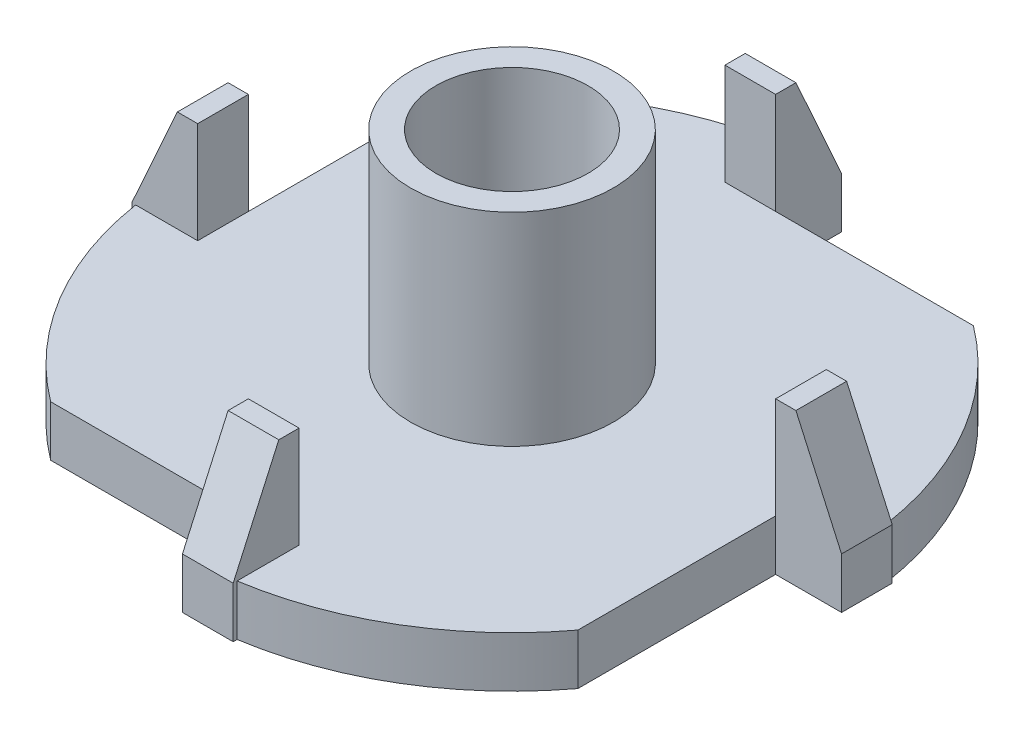
ISO-10303-21;
HEADER;
FILE_DESCRIPTION(('STEP AP214'),'2;1');
FILE_NAME('part.step','',(''),(''),'','','');
FILE_SCHEMA(('AUTOMOTIVE_DESIGN { 1 0 10303 214 1 1 1 1 }'));
ENDSEC;
DATA;
#1=APPLICATION_CONTEXT('core data for automotive mechanical design processes');
#2=APPLICATION_PROTOCOL_DEFINITION('international standard','automotive_design',2000,#1);
#3=PRODUCT_CONTEXT('',#1,'mechanical');
#4=PRODUCT('Part','Part','',(#3));
#5=PRODUCT_RELATED_PRODUCT_CATEGORY('part','',(#4));
#6=PRODUCT_DEFINITION_FORMATION('','',#4);
#7=PRODUCT_DEFINITION_CONTEXT('part definition',#1,'design');
#8=PRODUCT_DEFINITION('design','',#6,#7);
#9=PRODUCT_DEFINITION_SHAPE('','',#8);
#10=(LENGTH_UNIT() NAMED_UNIT(*) SI_UNIT(.MILLI.,.METRE.));
#11=(NAMED_UNIT(*) PLANE_ANGLE_UNIT() SI_UNIT($,.RADIAN.));
#12=(NAMED_UNIT(*) SI_UNIT($,.STERADIAN.) SOLID_ANGLE_UNIT());
#13=UNCERTAINTY_MEASURE_WITH_UNIT(LENGTH_MEASURE(1.E-05),#10,'distance_accuracy_value','');
#14=(GEOMETRIC_REPRESENTATION_CONTEXT(3) GLOBAL_UNCERTAINTY_ASSIGNED_CONTEXT((#13)) GLOBAL_UNIT_ASSIGNED_CONTEXT((#10,
#11,#12)) REPRESENTATION_CONTEXT('',''));
#15=CARTESIAN_POINT('',(0.,0.,0.));
#16=DIRECTION('',(0.,0.,1.));
#17=DIRECTION('',(1.,0.,0.));
#18=AXIS2_PLACEMENT_3D('',#15,#16,#17);
#19=CARTESIAN_POINT('',(0.,1.,0.));
#20=DIRECTION('',(0.,1.,0.));
#21=DIRECTION('',(0.,0.,1.));
#22=AXIS2_PLACEMENT_3D('',#19,#20,#21);
#23=PLANE('',#22);
#24=DIRECTION('',(0.,0.,-1.));
#25=VECTOR('',#24,1.);
#26=CARTESIAN_POINT('',(-5.2,1.,1.));
#27=LINE('',#26,#25);
#28=CARTESIAN_POINT('',(-5.2,1.,1.));
#29=VERTEX_POINT('',#28);
#30=CARTESIAN_POINT('',(-5.2,1.,0.));
#31=VERTEX_POINT('',#30);
#32=EDGE_CURVE('E56',#29,#31,#27,.T.);
#33=ORIENTED_EDGE('',*,*,#32,.F.);
#34=DIRECTION('',(-1.,0.,0.));
#35=VECTOR('',#34,1.);
#36=CARTESIAN_POINT('',(-5.2,1.,1.));
#37=LINE('',#36,#35);
#38=CARTESIAN_POINT('',(-6.42261628933257,1.,1.));
#39=VERTEX_POINT('',#38);
#40=EDGE_CURVE('E264',#29,#39,#37,.T.);
#41=ORIENTED_EDGE('',*,*,#40,.T.);
#42=CARTESIAN_POINT('',(0.,1.,0.));
#43=DIRECTION('',(0.,1.,0.));
#44=DIRECTION('',(0.,0.,1.));
#45=AXIS2_PLACEMENT_3D('',#42,#43,#44);
#46=CIRCLE('',#45,6.5);
#47=CARTESIAN_POINT('',(-3.9,1.,5.2));
#48=VERTEX_POINT('',#47);
#49=EDGE_CURVE('E364',#39,#48,#46,.T.);
#50=ORIENTED_EDGE('',*,*,#49,.T.);
#51=DIRECTION('',(1.,0.,0.));
#52=VECTOR('',#51,1.);
#53=CARTESIAN_POINT('',(-3.9,1.,5.2));
#54=LINE('',#53,#52);
#55=CARTESIAN_POINT('',(0.,1.,5.2));
#56=VERTEX_POINT('',#55);
#57=EDGE_CURVE('E367',#48,#56,#54,.T.);
#58=ORIENTED_EDGE('',*,*,#57,.T.);
#59=DIRECTION('',(-1.,0.,0.));
#60=VECTOR('',#59,1.);
#61=CARTESIAN_POINT('',(0.999999999999946,1.,5.20000000000001));
#62=LINE('',#61,#60);
#63=CARTESIAN_POINT('',(0.999999999999946,1.,5.20000000000001));
#64=VERTEX_POINT('',#63);
#65=EDGE_CURVE('E354',#64,#56,#62,.T.);
#66=ORIENTED_EDGE('',*,*,#65,.F.);
#67=DIRECTION('',(0.,0.,1.));
#68=VECTOR('',#67,1.);
#69=CARTESIAN_POINT('',(0.999999999999946,1.,5.20000000000001));
#70=LINE('',#69,#68);
#71=CARTESIAN_POINT('',(0.999999999999933,1.,6.42261628933258));
#72=VERTEX_POINT('',#71);
#73=EDGE_CURVE('E333',#64,#72,#70,.T.);
#74=ORIENTED_EDGE('',*,*,#73,.T.);
#75=CARTESIAN_POINT('',(0.,1.,0.));
#76=DIRECTION('',(0.,1.,0.));
#77=DIRECTION('',(0.,0.,1.));
#78=AXIS2_PLACEMENT_3D('',#75,#76,#77);
#79=CIRCLE('',#78,6.5);
#80=CARTESIAN_POINT('',(5.2,1.,3.9));
#81=VERTEX_POINT('',#80);
#82=EDGE_CURVE('E373',#72,#81,#79,.T.);
#83=ORIENTED_EDGE('',*,*,#82,.T.);
#84=DIRECTION('',(0.,0.,-1.));
#85=VECTOR('',#84,1.);
#86=CARTESIAN_POINT('',(5.2,1.,3.9));
#87=LINE('',#86,#85);
#88=CARTESIAN_POINT('',(5.2,1.,0.));
#89=VERTEX_POINT('',#88);
#90=EDGE_CURVE('E375',#81,#89,#87,.T.);
#91=ORIENTED_EDGE('',*,*,#90,.T.);
#92=DIRECTION('',(0.,0.,1.));
#93=VECTOR('',#92,1.);
#94=CARTESIAN_POINT('',(5.20000000000001,1.,-0.999999999999964));
#95=LINE('',#94,#93);
#96=CARTESIAN_POINT('',(5.20000000000001,1.,-0.999999999999964));
#97=VERTEX_POINT('',#96);
#98=EDGE_CURVE('E326',#97,#89,#95,.T.);
#99=ORIENTED_EDGE('',*,*,#98,.F.);
#100=DIRECTION('',(1.,0.,0.));
#101=VECTOR('',#100,1.);
#102=CARTESIAN_POINT('',(5.20000000000001,1.,-0.999999999999964));
#103=LINE('',#102,#101);
#104=CARTESIAN_POINT('',(6.42261628933257,1.,-0.999999999999955));
#105=VERTEX_POINT('',#104);
#106=EDGE_CURVE('E305',#97,#105,#103,.T.);
#107=ORIENTED_EDGE('',*,*,#106,.T.);
#108=CARTESIAN_POINT('',(0.,1.,0.));
#109=DIRECTION('',(0.,1.,0.));
#110=DIRECTION('',(0.,0.,1.));
#111=AXIS2_PLACEMENT_3D('',#108,#109,#110);
#112=CIRCLE('',#111,6.5);
#113=CARTESIAN_POINT('',(3.9,1.,-5.2));
#114=VERTEX_POINT('',#113);
#115=EDGE_CURVE('E380',#105,#114,#112,.T.);
#116=ORIENTED_EDGE('',*,*,#115,.T.);
#117=DIRECTION('',(-1.,0.,0.));
#118=VECTOR('',#117,1.);
#119=CARTESIAN_POINT('',(3.9,1.,-5.2));
#120=LINE('',#119,#118);
#121=CARTESIAN_POINT('',(0.,1.,-5.2));
#122=VERTEX_POINT('',#121);
#123=EDGE_CURVE('E382',#114,#122,#120,.T.);
#124=ORIENTED_EDGE('',*,*,#123,.T.);
#125=DIRECTION('',(1.,0.,0.));
#126=VECTOR('',#125,1.);
#127=CARTESIAN_POINT('',(-0.999999999999946,1.,-5.20000000000001));
#128=LINE('',#127,#126);
#129=CARTESIAN_POINT('',(-0.999999999999946,1.,-5.20000000000001));
#130=VERTEX_POINT('',#129);
#131=EDGE_CURVE('E63',#130,#122,#128,.T.);
#132=ORIENTED_EDGE('',*,*,#131,.F.);
#133=DIRECTION('',(0.,0.,-1.));
#134=VECTOR('',#133,1.);
#135=CARTESIAN_POINT('',(-0.999999999999946,1.,-5.20000000000001));
#136=LINE('',#135,#134);
#137=CARTESIAN_POINT('',(-0.999999999999933,1.,-6.42261628933258));
#138=VERTEX_POINT('',#137);
#139=EDGE_CURVE('E280',#130,#138,#136,.T.);
#140=ORIENTED_EDGE('',*,*,#139,.T.);
#141=CARTESIAN_POINT('',(0.,1.,0.));
#142=DIRECTION('',(0.,1.,0.));
#143=DIRECTION('',(0.,0.,1.));
#144=AXIS2_PLACEMENT_3D('',#141,#142,#143);
#145=CIRCLE('',#144,6.5);
#146=CARTESIAN_POINT('',(-5.2,1.,-3.9));
#147=VERTEX_POINT('',#146);
#148=EDGE_CURVE('E387',#138,#147,#145,.T.);
#149=ORIENTED_EDGE('',*,*,#148,.T.);
#150=DIRECTION('',(0.,0.,1.));
#151=VECTOR('',#150,1.);
#152=CARTESIAN_POINT('',(-5.2,1.,-3.9));
#153=LINE('',#152,#151);
#154=EDGE_CURVE('E389',#147,#31,#153,.T.);
#155=ORIENTED_EDGE('',*,*,#154,.T.);
#156=EDGE_LOOP('',(#33,#41,#50,#58,#66,#74,#83,#91,#99,#107,#116,#124,#132,#140,#149,#155));
#157=FACE_BOUND('',#156,.T.);
#158=CARTESIAN_POINT('',(0.,1.,0.));
#159=DIRECTION('',(0.,1.,0.));
#160=DIRECTION('',(0.,0.,1.));
#161=AXIS2_PLACEMENT_3D('',#158,#159,#160);
#162=CIRCLE('',#161,2.);
#163=CARTESIAN_POINT('',(0.,1.,2.));
#164=VERTEX_POINT('',#163);
#165=EDGE_CURVE('E935',#164,#164,#162,.T.);
#166=ORIENTED_EDGE('',*,*,#165,.F.);
#167=EDGE_LOOP('',(#166));
#168=FACE_BOUND('',#167,.T.);
#169=ADVANCED_FACE('F41',(#157,#168),#23,.T.);
#170=CARTESIAN_POINT('',(0.,0.,0.));
#171=DIRECTION('',(0.,1.,0.));
#172=DIRECTION('',(0.,0.,1.));
#173=AXIS2_PLACEMENT_3D('',#170,#171,#172);
#174=PLANE('',#173);
#175=CARTESIAN_POINT('',(0.,0.,0.));
#176=DIRECTION('',(0.,1.,0.));
#177=DIRECTION('',(0.,0.,1.));
#178=AXIS2_PLACEMENT_3D('',#175,#176,#177);
#179=CIRCLE('',#178,6.5);
#180=CARTESIAN_POINT('',(-6.42261628933257,0.,1.));
#181=VERTEX_POINT('',#180);
#182=CARTESIAN_POINT('',(-3.9,0.,5.2));
#183=VERTEX_POINT('',#182);
#184=EDGE_CURVE('E363',#181,#183,#179,.T.);
#185=ORIENTED_EDGE('',*,*,#184,.F.);
#186=DIRECTION('',(1.,0.,0.));
#187=VECTOR('',#186,1.);
#188=CARTESIAN_POINT('',(-6.5,0.,1.));
#189=LINE('',#188,#187);
#190=CARTESIAN_POINT('',(-6.5,0.,1.));
#191=VERTEX_POINT('',#190);
#192=EDGE_CURVE('E368',#191,#181,#189,.T.);
#193=ORIENTED_EDGE('',*,*,#192,.F.);
#194=DIRECTION('',(0.,0.,1.));
#195=VECTOR('',#194,1.);
#196=CARTESIAN_POINT('',(-6.5,0.,0.));
#197=LINE('',#196,#195);
#198=CARTESIAN_POINT('',(-6.5,0.,0.));
#199=VERTEX_POINT('',#198);
#200=EDGE_CURVE('E429',#199,#191,#197,.T.);
#201=ORIENTED_EDGE('',*,*,#200,.F.);
#202=DIRECTION('',(-1.,0.,0.));
#203=VECTOR('',#202,1.);
#204=CARTESIAN_POINT('',(-5.2,0.,0.));
#205=LINE('',#204,#203);
#206=CARTESIAN_POINT('',(-5.2,0.,0.));
#207=VERTEX_POINT('',#206);
#208=EDGE_CURVE('E427',#207,#199,#205,.T.);
#209=ORIENTED_EDGE('',*,*,#208,.F.);
#210=DIRECTION('',(0.,0.,1.));
#211=VECTOR('',#210,1.);
#212=CARTESIAN_POINT('',(-5.2,0.,-3.9));
#213=LINE('',#212,#211);
#214=CARTESIAN_POINT('',(-5.2,0.,-3.9));
#215=VERTEX_POINT('',#214);
#216=EDGE_CURVE('E425',#215,#207,#213,.T.);
#217=ORIENTED_EDGE('',*,*,#216,.F.);
#218=CARTESIAN_POINT('',(0.,0.,0.));
#219=DIRECTION('',(0.,1.,0.));
#220=DIRECTION('',(0.,0.,1.));
#221=AXIS2_PLACEMENT_3D('',#218,#219,#220);
#222=CIRCLE('',#221,6.5);
#223=CARTESIAN_POINT('',(-0.999999999999977,0.,-6.42261628933257));
#224=VERTEX_POINT('',#223);
#225=EDGE_CURVE('E423',#224,#215,#222,.T.);
#226=ORIENTED_EDGE('',*,*,#225,.F.);
#227=DIRECTION('',(0.,0.,1.));
#228=VECTOR('',#227,1.);
#229=CARTESIAN_POINT('',(-0.999999999999977,0.,-6.5));
#230=LINE('',#229,#228);
#231=CARTESIAN_POINT('',(-0.999999999999977,0.,-6.5));
#232=VERTEX_POINT('',#231);
#233=EDGE_CURVE('E421',#232,#224,#230,.T.);
#234=ORIENTED_EDGE('',*,*,#233,.F.);
#235=DIRECTION('',(-1.,0.,0.));
#236=VECTOR('',#235,1.);
#237=CARTESIAN_POINT('',(0.,0.,-6.5));
#238=LINE('',#237,#236);
#239=CARTESIAN_POINT('',(0.,0.,-6.5));
#240=VERTEX_POINT('',#239);
#241=EDGE_CURVE('E419',#240,#232,#238,.T.);
#242=ORIENTED_EDGE('',*,*,#241,.F.);
#243=DIRECTION('',(0.,0.,-1.));
#244=VECTOR('',#243,1.);
#245=CARTESIAN_POINT('',(0.,0.,-5.2));
#246=LINE('',#245,#244);
#247=CARTESIAN_POINT('',(0.,0.,-5.2));
#248=VERTEX_POINT('',#247);
#249=EDGE_CURVE('E417',#248,#240,#246,.T.);
#250=ORIENTED_EDGE('',*,*,#249,.F.);
#251=DIRECTION('',(-1.,0.,0.));
#252=VECTOR('',#251,1.);
#253=CARTESIAN_POINT('',(3.9,0.,-5.2));
#254=LINE('',#253,#252);
#255=CARTESIAN_POINT('',(3.9,0.,-5.2));
#256=VERTEX_POINT('',#255);
#257=EDGE_CURVE('E415',#256,#248,#254,.T.);
#258=ORIENTED_EDGE('',*,*,#257,.F.);
#259=CARTESIAN_POINT('',(0.,0.,0.));
#260=DIRECTION('',(0.,1.,0.));
#261=DIRECTION('',(0.,0.,1.));
#262=AXIS2_PLACEMENT_3D('',#259,#260,#261);
#263=CIRCLE('',#262,6.5);
#264=CARTESIAN_POINT('',(6.42261628933257,0.,-0.999999999999956));
#265=VERTEX_POINT('',#264);
#266=EDGE_CURVE('E413',#265,#256,#263,.T.);
#267=ORIENTED_EDGE('',*,*,#266,.F.);
#268=DIRECTION('',(-1.,0.,0.));
#269=VECTOR('',#268,1.);
#270=CARTESIAN_POINT('',(6.50000000000001,0.,-0.999999999999955));
#271=LINE('',#270,#269);
#272=CARTESIAN_POINT('',(6.50000000000001,0.,-0.999999999999955));
#273=VERTEX_POINT('',#272);
#274=EDGE_CURVE('E411',#273,#265,#271,.T.);
#275=ORIENTED_EDGE('',*,*,#274,.F.);
#276=DIRECTION('',(0.,0.,-1.));
#277=VECTOR('',#276,1.);
#278=CARTESIAN_POINT('',(6.5,0.,0.));
#279=LINE('',#278,#277);
#280=CARTESIAN_POINT('',(6.5,0.,0.));
#281=VERTEX_POINT('',#280);
#282=EDGE_CURVE('E409',#281,#273,#279,.T.);
#283=ORIENTED_EDGE('',*,*,#282,.F.);
#284=DIRECTION('',(1.,0.,0.));
#285=VECTOR('',#284,1.);
#286=CARTESIAN_POINT('',(5.2,0.,0.));
#287=LINE('',#286,#285);
#288=CARTESIAN_POINT('',(5.2,0.,0.));
#289=VERTEX_POINT('',#288);
#290=EDGE_CURVE('E407',#289,#281,#287,.T.);
#291=ORIENTED_EDGE('',*,*,#290,.F.);
#292=DIRECTION('',(0.,0.,-1.));
#293=VECTOR('',#292,1.);
#294=CARTESIAN_POINT('',(5.2,0.,3.9));
#295=LINE('',#294,#293);
#296=CARTESIAN_POINT('',(5.2,0.,3.9));
#297=VERTEX_POINT('',#296);
#298=EDGE_CURVE('E405',#297,#289,#295,.T.);
#299=ORIENTED_EDGE('',*,*,#298,.F.);
#300=CARTESIAN_POINT('',(0.,0.,0.));
#301=DIRECTION('',(0.,1.,0.));
#302=DIRECTION('',(0.,0.,1.));
#303=AXIS2_PLACEMENT_3D('',#300,#301,#302);
#304=CIRCLE('',#303,6.5);
#305=CARTESIAN_POINT('',(0.999999999999933,0.,6.42261628933258));
#306=VERTEX_POINT('',#305);
#307=EDGE_CURVE('E403',#306,#297,#304,.T.);
#308=ORIENTED_EDGE('',*,*,#307,.F.);
#309=DIRECTION('',(0.,0.,-1.));
#310=VECTOR('',#309,1.);
#311=CARTESIAN_POINT('',(0.999999999999932,0.,6.50000000000001));
#312=LINE('',#311,#310);
#313=CARTESIAN_POINT('',(0.999999999999932,0.,6.50000000000001));
#314=VERTEX_POINT('',#313);
#315=EDGE_CURVE('E401',#314,#306,#312,.T.);
#316=ORIENTED_EDGE('',*,*,#315,.F.);
#317=DIRECTION('',(1.,0.,0.));
#318=VECTOR('',#317,1.);
#319=CARTESIAN_POINT('',(0.,0.,6.5));
#320=LINE('',#319,#318);
#321=CARTESIAN_POINT('',(0.,0.,6.5));
#322=VERTEX_POINT('',#321);
#323=EDGE_CURVE('E399',#322,#314,#320,.T.);
#324=ORIENTED_EDGE('',*,*,#323,.F.);
#325=DIRECTION('',(0.,0.,1.));
#326=VECTOR('',#325,1.);
#327=CARTESIAN_POINT('',(0.,0.,5.2));
#328=LINE('',#327,#326);
#329=CARTESIAN_POINT('',(0.,0.,5.2));
#330=VERTEX_POINT('',#329);
#331=EDGE_CURVE('E397',#330,#322,#328,.T.);
#332=ORIENTED_EDGE('',*,*,#331,.F.);
#333=DIRECTION('',(1.,0.,0.));
#334=VECTOR('',#333,1.);
#335=CARTESIAN_POINT('',(-3.9,0.,5.2));
#336=LINE('',#335,#334);
#337=EDGE_CURVE('E395',#183,#330,#336,.T.);
#338=ORIENTED_EDGE('',*,*,#337,.F.);
#339=EDGE_LOOP('',(#185,#193,#201,#209,#217,#226,#234,#242,#250,#258,#267,#275,#283,#291,#299,
#308,#316,#324,#332,#338));
#340=FACE_BOUND('',#339,.T.);
#341=CARTESIAN_POINT('',(0.,0.,0.));
#342=DIRECTION('',(0.,1.,0.));
#343=DIRECTION('',(0.,0.,1.));
#344=AXIS2_PLACEMENT_3D('',#341,#342,#343);
#345=CIRCLE('',#344,1.5);
#346=CARTESIAN_POINT('',(0.,0.,1.5));
#347=VERTEX_POINT('',#346);
#348=EDGE_CURVE('E357',#347,#347,#345,.T.);
#349=ORIENTED_EDGE('',*,*,#348,.T.);
#350=EDGE_LOOP('',(#349));
#351=FACE_BOUND('',#350,.T.);
#352=ADVANCED_FACE('F493',(#340,#351),#174,.F.);
#353=CARTESIAN_POINT('',(0.,1.,0.));
#354=DIRECTION('',(0.,-1.,0.));
#355=DIRECTION('',(0.,0.,-1.));
#356=AXIS2_PLACEMENT_3D('',#353,#354,#355);
#357=CYLINDRICAL_SURFACE('',#356,6.5);
#358=ORIENTED_EDGE('',*,*,#184,.T.);
#359=DIRECTION('',(0.,-1.,0.));
#360=VECTOR('',#359,1.);
#361=CARTESIAN_POINT('',(-3.9,1.,5.2));
#362=LINE('',#361,#360);
#363=EDGE_CURVE('E11',#48,#183,#362,.T.);
#364=ORIENTED_EDGE('',*,*,#363,.F.);
#365=ORIENTED_EDGE('',*,*,#49,.F.);
#366=DIRECTION('',(0.,-1.,0.));
#367=VECTOR('',#366,1.);
#368=CARTESIAN_POINT('',(-6.42261628933257,1.,1.));
#369=LINE('',#368,#367);
#370=EDGE_CURVE('E392',#39,#181,#369,.T.);
#371=ORIENTED_EDGE('',*,*,#370,.T.);
#372=EDGE_LOOP('',(#358,#364,#365,#371));
#373=FACE_BOUND('',#372,.T.);
#374=ADVANCED_FACE('F43',(#373),#357,.T.);
#375=CARTESIAN_POINT('',(-3.9,1.,5.2));
#376=DIRECTION('',(0.,0.,-1.));
#377=DIRECTION('',(-1.,0.,0.));
#378=AXIS2_PLACEMENT_3D('',#375,#376,#377);
#379=PLANE('',#378);
#380=ORIENTED_EDGE('',*,*,#337,.T.);
#381=DIRECTION('',(0.,-1.,0.));
#382=VECTOR('',#381,1.);
#383=CARTESIAN_POINT('',(0.,1.,5.2));
#384=LINE('',#383,#382);
#385=EDGE_CURVE('E49',#56,#330,#384,.T.);
#386=ORIENTED_EDGE('',*,*,#385,.F.);
#387=ORIENTED_EDGE('',*,*,#57,.F.);
#388=ORIENTED_EDGE('',*,*,#363,.T.);
#389=EDGE_LOOP('',(#380,#386,#387,#388));
#390=FACE_BOUND('',#389,.T.);
#391=ADVANCED_FACE('F583',(#390),#379,.F.);
#392=CARTESIAN_POINT('',(0.,1.,5.2));
#393=DIRECTION('',(1.,0.,0.));
#394=DIRECTION('',(0.,0.,-1.));
#395=AXIS2_PLACEMENT_3D('',#392,#393,#394);
#396=PLANE('',#395);
#397=ORIENTED_EDGE('',*,*,#331,.T.);
#398=DIRECTION('',(0.,-1.,0.));
#399=VECTOR('',#398,1.);
#400=CARTESIAN_POINT('',(0.,1.,6.5));
#401=LINE('',#400,#399);
#402=CARTESIAN_POINT('',(0.,1.,6.5));
#403=VERTEX_POINT('',#402);
#404=EDGE_CURVE('E481',#403,#322,#401,.T.);
#405=ORIENTED_EDGE('',*,*,#404,.F.);
#406=DIRECTION('',(0.,0.911921505175106,-0.410364677328798));
#407=VECTOR('',#406,1.);
#408=CARTESIAN_POINT('',(0.,1.,6.5));
#409=LINE('',#408,#407);
#410=CARTESIAN_POINT('',(0.,3.,5.6));
#411=VERTEX_POINT('',#410);
#412=EDGE_CURVE('E329',#403,#411,#409,.T.);
#413=ORIENTED_EDGE('',*,*,#412,.T.);
#414=DIRECTION('',(0.,0.,-1.));
#415=VECTOR('',#414,1.);
#416=CARTESIAN_POINT('',(0.,3.,5.2));
#417=LINE('',#416,#415);
#418=CARTESIAN_POINT('',(0.,3.,5.2));
#419=VERTEX_POINT('',#418);
#420=EDGE_CURVE('E349',#411,#419,#417,.T.);
#421=ORIENTED_EDGE('',*,*,#420,.T.);
#422=DIRECTION('',(0.,-1.,0.));
#423=VECTOR('',#422,1.);
#424=CARTESIAN_POINT('',(0.,1.,5.2));
#425=LINE('',#424,#423);
#426=EDGE_CURVE('E337',#419,#56,#425,.T.);
#427=ORIENTED_EDGE('',*,*,#426,.T.);
#428=ORIENTED_EDGE('',*,*,#385,.T.);
#429=EDGE_LOOP('',(#397,#405,#413,#421,#427,#428));
#430=FACE_BOUND('',#429,.T.);
#431=ADVANCED_FACE('F487',(#430),#396,.F.);
#432=CARTESIAN_POINT('',(0.,1.,6.5));
#433=DIRECTION('',(0.,0.,-1.));
#434=DIRECTION('',(-1.,0.,0.));
#435=AXIS2_PLACEMENT_3D('',#432,#433,#434);
#436=PLANE('',#435);
#437=ORIENTED_EDGE('',*,*,#323,.T.);
#438=DIRECTION('',(0.,-1.,0.));
#439=VECTOR('',#438,1.);
#440=CARTESIAN_POINT('',(0.999999999999932,1.,6.50000000000001));
#441=LINE('',#440,#439);
#442=CARTESIAN_POINT('',(0.999999999999932,1.,6.50000000000001));
#443=VERTEX_POINT('',#442);
#444=EDGE_CURVE('E478',#443,#314,#441,.T.);
#445=ORIENTED_EDGE('',*,*,#444,.F.);
#446=DIRECTION('',(1.,0.,0.));
#447=VECTOR('',#446,1.);
#448=CARTESIAN_POINT('',(0.,1.,6.5));
#449=LINE('',#448,#447);
#450=EDGE_CURVE('E370',#403,#443,#449,.T.);
#451=ORIENTED_EDGE('',*,*,#450,.F.);
#452=ORIENTED_EDGE('',*,*,#404,.T.);
#453=EDGE_LOOP('',(#437,#445,#451,#452));
#454=FACE_BOUND('',#453,.T.);
#455=ADVANCED_FACE('F498',(#454),#436,.F.);
#456=CARTESIAN_POINT('',(0.999999999999932,1.,6.50000000000001));
#457=DIRECTION('',(-1.,0.,0.));
#458=DIRECTION('',(0.,0.,1.));
#459=AXIS2_PLACEMENT_3D('',#456,#457,#458);
#460=PLANE('',#459);
#461=ORIENTED_EDGE('',*,*,#315,.T.);
#462=DIRECTION('',(0.,-1.,0.));
#463=VECTOR('',#462,1.);
#464=CARTESIAN_POINT('',(0.999999999999933,1.,6.42261628933258));
#465=LINE('',#464,#463);
#466=EDGE_CURVE('E475',#72,#306,#465,.T.);
#467=ORIENTED_EDGE('',*,*,#466,.F.);
#468=ORIENTED_EDGE('',*,*,#73,.F.);
#469=DIRECTION('',(0.,-1.,0.));
#470=VECTOR('',#469,1.);
#471=CARTESIAN_POINT('',(0.999999999999946,1.,5.20000000000001));
#472=LINE('',#471,#470);
#473=CARTESIAN_POINT('',(0.999999999999946,3.,5.20000000000001));
#474=VERTEX_POINT('',#473);
#475=EDGE_CURVE('E343',#474,#64,#472,.T.);
#476=ORIENTED_EDGE('',*,*,#475,.F.);
#477=DIRECTION('',(0.,0.,-1.));
#478=VECTOR('',#477,1.);
#479=CARTESIAN_POINT('',(0.999999999999946,3.,5.20000000000001));
#480=LINE('',#479,#478);
#481=CARTESIAN_POINT('',(0.999999999999941,3.,5.60000000000001));
#482=VERTEX_POINT('',#481);
#483=EDGE_CURVE('E340',#482,#474,#480,.T.);
#484=ORIENTED_EDGE('',*,*,#483,.F.);
#485=DIRECTION('',(0.,0.911921505175106,-0.410364677328798));
#486=VECTOR('',#485,1.);
#487=CARTESIAN_POINT('',(0.999999999999932,1.,6.50000000000001));
#488=LINE('',#487,#486);
#489=EDGE_CURVE('E336',#443,#482,#488,.T.);
#490=ORIENTED_EDGE('',*,*,#489,.F.);
#491=ORIENTED_EDGE('',*,*,#444,.T.);
#492=EDGE_LOOP('',(#461,#467,#468,#476,#484,#490,#491));
#493=FACE_BOUND('',#492,.T.);
#494=ADVANCED_FACE('F502',(#493),#460,.F.);
#495=CARTESIAN_POINT('',(0.,1.,0.));
#496=DIRECTION('',(0.,-1.,0.));
#497=DIRECTION('',(0.,0.,-1.));
#498=AXIS2_PLACEMENT_3D('',#495,#496,#497);
#499=CYLINDRICAL_SURFACE('',#498,6.5);
#500=ORIENTED_EDGE('',*,*,#307,.T.);
#501=DIRECTION('',(0.,-1.,0.));
#502=VECTOR('',#501,1.);
#503=CARTESIAN_POINT('',(5.2,1.,3.9));
#504=LINE('',#503,#502);
#505=EDGE_CURVE('E472',#81,#297,#504,.T.);
#506=ORIENTED_EDGE('',*,*,#505,.F.);
#507=ORIENTED_EDGE('',*,*,#82,.F.);
#508=ORIENTED_EDGE('',*,*,#466,.T.);
#509=EDGE_LOOP('',(#500,#506,#507,#508));
#510=FACE_BOUND('',#509,.T.);
#511=ADVANCED_FACE('F516',(#510),#499,.T.);
#512=CARTESIAN_POINT('',(5.2,1.,3.9));
#513=DIRECTION('',(-1.,0.,0.));
#514=DIRECTION('',(0.,0.,1.));
#515=AXIS2_PLACEMENT_3D('',#512,#513,#514);
#516=PLANE('',#515);
#517=ORIENTED_EDGE('',*,*,#298,.T.);
#518=DIRECTION('',(0.,-1.,0.));
#519=VECTOR('',#518,1.);
#520=CARTESIAN_POINT('',(5.2,1.,0.));
#521=LINE('',#520,#519);
#522=EDGE_CURVE('E469',#89,#289,#521,.T.);
#523=ORIENTED_EDGE('',*,*,#522,.F.);
#524=ORIENTED_EDGE('',*,*,#90,.F.);
#525=ORIENTED_EDGE('',*,*,#505,.T.);
#526=EDGE_LOOP('',(#517,#523,#524,#525));
#527=FACE_BOUND('',#526,.T.);
#528=ADVANCED_FACE('F523',(#527),#516,.F.);
#529=CARTESIAN_POINT('',(5.2,1.,0.));
#530=DIRECTION('',(0.,0.,-1.));
#531=DIRECTION('',(-1.,0.,0.));
#532=AXIS2_PLACEMENT_3D('',#529,#530,#531);
#533=PLANE('',#532);
#534=ORIENTED_EDGE('',*,*,#290,.T.);
#535=DIRECTION('',(0.,-1.,0.));
#536=VECTOR('',#535,1.);
#537=CARTESIAN_POINT('',(6.5,1.,0.));
#538=LINE('',#537,#536);
#539=CARTESIAN_POINT('',(6.5,1.,0.));
#540=VERTEX_POINT('',#539);
#541=EDGE_CURVE('E466',#540,#281,#538,.T.);
#542=ORIENTED_EDGE('',*,*,#541,.F.);
#543=DIRECTION('',(-0.410364677328798,0.911921505175106,0.));
#544=VECTOR('',#543,1.);
#545=CARTESIAN_POINT('',(6.5,1.,0.));
#546=LINE('',#545,#544);
#547=CARTESIAN_POINT('',(5.6,3.,0.));
#548=VERTEX_POINT('',#547);
#549=EDGE_CURVE('E301',#540,#548,#546,.T.);
#550=ORIENTED_EDGE('',*,*,#549,.T.);
#551=DIRECTION('',(-1.,0.,0.));
#552=VECTOR('',#551,1.);
#553=CARTESIAN_POINT('',(5.2,3.,0.));
#554=LINE('',#553,#552);
#555=CARTESIAN_POINT('',(5.2,3.,0.));
#556=VERTEX_POINT('',#555);
#557=EDGE_CURVE('E321',#548,#556,#554,.T.);
#558=ORIENTED_EDGE('',*,*,#557,.T.);
#559=DIRECTION('',(0.,-1.,0.));
#560=VECTOR('',#559,1.);
#561=CARTESIAN_POINT('',(5.2,1.,0.));
#562=LINE('',#561,#560);
#563=EDGE_CURVE('E309',#556,#89,#562,.T.);
#564=ORIENTED_EDGE('',*,*,#563,.T.);
#565=ORIENTED_EDGE('',*,*,#522,.T.);
#566=EDGE_LOOP('',(#534,#542,#550,#558,#564,#565));
#567=FACE_BOUND('',#566,.T.);
#568=ADVANCED_FACE('F526',(#567),#533,.F.);
#569=CARTESIAN_POINT('',(6.5,1.,0.));
#570=DIRECTION('',(-1.,0.,0.));
#571=DIRECTION('',(0.,0.,1.));
#572=AXIS2_PLACEMENT_3D('',#569,#570,#571);
#573=PLANE('',#572);
#574=ORIENTED_EDGE('',*,*,#282,.T.);
#575=DIRECTION('',(0.,-1.,0.));
#576=VECTOR('',#575,1.);
#577=CARTESIAN_POINT('',(6.50000000000001,1.,-0.999999999999955));
#578=LINE('',#577,#576);
#579=CARTESIAN_POINT('',(6.50000000000001,1.,-0.999999999999955));
#580=VERTEX_POINT('',#579);
#581=EDGE_CURVE('E463',#580,#273,#578,.T.);
#582=ORIENTED_EDGE('',*,*,#581,.F.);
#583=DIRECTION('',(0.,0.,-1.));
#584=VECTOR('',#583,1.);
#585=CARTESIAN_POINT('',(6.5,1.,0.));
#586=LINE('',#585,#584);
#587=EDGE_CURVE('E377',#540,#580,#586,.T.);
#588=ORIENTED_EDGE('',*,*,#587,.F.);
#589=ORIENTED_EDGE('',*,*,#541,.T.);
#590=EDGE_LOOP('',(#574,#582,#588,#589));
#591=FACE_BOUND('',#590,.T.);
#592=ADVANCED_FACE('F624',(#591),#573,.F.);
#593=CARTESIAN_POINT('',(6.50000000000001,1.,-0.999999999999955));
#594=DIRECTION('',(0.,0.,1.));
#595=DIRECTION('',(1.,0.,0.));
#596=AXIS2_PLACEMENT_3D('',#593,#594,#595);
#597=PLANE('',#596);
#598=ORIENTED_EDGE('',*,*,#274,.T.);
#599=DIRECTION('',(0.,-1.,0.));
#600=VECTOR('',#599,1.);
#601=CARTESIAN_POINT('',(6.42261628933257,1.,-0.999999999999956));
#602=LINE('',#601,#600);
#603=EDGE_CURVE('E460',#105,#265,#602,.T.);
#604=ORIENTED_EDGE('',*,*,#603,.F.);
#605=ORIENTED_EDGE('',*,*,#106,.F.);
#606=DIRECTION('',(0.,-1.,0.));
#607=VECTOR('',#606,1.);
#608=CARTESIAN_POINT('',(5.20000000000001,1.,-0.999999999999964));
#609=LINE('',#608,#607);
#610=CARTESIAN_POINT('',(5.20000000000001,3.,-0.999999999999964));
#611=VERTEX_POINT('',#610);
#612=EDGE_CURVE('E315',#611,#97,#609,.T.);
#613=ORIENTED_EDGE('',*,*,#612,.F.);
#614=DIRECTION('',(-1.,0.,0.));
#615=VECTOR('',#614,1.);
#616=CARTESIAN_POINT('',(5.20000000000001,3.,-0.999999999999964));
#617=LINE('',#616,#615);
#618=CARTESIAN_POINT('',(5.60000000000001,3.,-0.999999999999961));
#619=VERTEX_POINT('',#618);
#620=EDGE_CURVE('E312',#619,#611,#617,.T.);
#621=ORIENTED_EDGE('',*,*,#620,.F.);
#622=DIRECTION('',(-0.410364677328798,0.911921505175106,0.));
#623=VECTOR('',#622,1.);
#624=CARTESIAN_POINT('',(6.50000000000001,1.,-0.999999999999955));
#625=LINE('',#624,#623);
#626=EDGE_CURVE('E308',#580,#619,#625,.T.);
#627=ORIENTED_EDGE('',*,*,#626,.F.);
#628=ORIENTED_EDGE('',*,*,#581,.T.);
#629=EDGE_LOOP('',(#598,#604,#605,#613,#621,#627,#628));
#630=FACE_BOUND('',#629,.T.);
#631=ADVANCED_FACE('F535',(#630),#597,.F.);
#632=CARTESIAN_POINT('',(0.,1.,0.));
#633=DIRECTION('',(0.,-1.,0.));
#634=DIRECTION('',(0.,0.,-1.));
#635=AXIS2_PLACEMENT_3D('',#632,#633,#634);
#636=CYLINDRICAL_SURFACE('',#635,6.5);
#637=ORIENTED_EDGE('',*,*,#266,.T.);
#638=DIRECTION('',(0.,-1.,0.));
#639=VECTOR('',#638,1.);
#640=CARTESIAN_POINT('',(3.9,1.,-5.2));
#641=LINE('',#640,#639);
#642=EDGE_CURVE('E457',#114,#256,#641,.T.);
#643=ORIENTED_EDGE('',*,*,#642,.F.);
#644=ORIENTED_EDGE('',*,*,#115,.F.);
#645=ORIENTED_EDGE('',*,*,#603,.T.);
#646=EDGE_LOOP('',(#637,#643,#644,#645));
#647=FACE_BOUND('',#646,.T.);
#648=ADVANCED_FACE('F540',(#647),#636,.T.);
#649=CARTESIAN_POINT('',(3.9,1.,-5.2));
#650=DIRECTION('',(0.,0.,1.));
#651=DIRECTION('',(1.,0.,0.));
#652=AXIS2_PLACEMENT_3D('',#649,#650,#651);
#653=PLANE('',#652);
#654=ORIENTED_EDGE('',*,*,#257,.T.);
#655=DIRECTION('',(0.,-1.,0.));
#656=VECTOR('',#655,1.);
#657=CARTESIAN_POINT('',(0.,1.,-5.2));
#658=LINE('',#657,#656);
#659=EDGE_CURVE('E454',#122,#248,#658,.T.);
#660=ORIENTED_EDGE('',*,*,#659,.F.);
#661=ORIENTED_EDGE('',*,*,#123,.F.);
#662=ORIENTED_EDGE('',*,*,#642,.T.);
#663=EDGE_LOOP('',(#654,#660,#661,#662));
#664=FACE_BOUND('',#663,.T.);
#665=ADVANCED_FACE('F547',(#664),#653,.F.);
#666=CARTESIAN_POINT('',(0.,1.,-5.2));
#667=DIRECTION('',(-1.,0.,0.));
#668=DIRECTION('',(0.,0.,1.));
#669=AXIS2_PLACEMENT_3D('',#666,#667,#668);
#670=PLANE('',#669);
#671=ORIENTED_EDGE('',*,*,#249,.T.);
#672=DIRECTION('',(0.,-1.,0.));
#673=VECTOR('',#672,1.);
#674=CARTESIAN_POINT('',(0.,1.,-6.5));
#675=LINE('',#674,#673);
#676=CARTESIAN_POINT('',(0.,1.,-6.5));
#677=VERTEX_POINT('',#676);
#678=EDGE_CURVE('E451',#677,#240,#675,.T.);
#679=ORIENTED_EDGE('',*,*,#678,.F.);
#680=DIRECTION('',(0.,0.911921505175106,0.410364677328798));
#681=VECTOR('',#680,1.);
#682=CARTESIAN_POINT('',(0.,1.,-6.5));
#683=LINE('',#682,#681);
#684=CARTESIAN_POINT('',(0.,3.,-5.6));
#685=VERTEX_POINT('',#684);
#686=EDGE_CURVE('E278',#677,#685,#683,.T.);
#687=ORIENTED_EDGE('',*,*,#686,.T.);
#688=DIRECTION('',(0.,0.,1.));
#689=VECTOR('',#688,1.);
#690=CARTESIAN_POINT('',(0.,3.,-5.2));
#691=LINE('',#690,#689);
#692=CARTESIAN_POINT('',(0.,3.,-5.2));
#693=VERTEX_POINT('',#692);
#694=EDGE_CURVE('E295',#685,#693,#691,.T.);
#695=ORIENTED_EDGE('',*,*,#694,.T.);
#696=DIRECTION('',(0.,-1.,0.));
#697=VECTOR('',#696,1.);
#698=CARTESIAN_POINT('',(0.,1.,-5.2));
#699=LINE('',#698,#697);
#700=EDGE_CURVE('E283',#693,#122,#699,.T.);
#701=ORIENTED_EDGE('',*,*,#700,.T.);
#702=ORIENTED_EDGE('',*,*,#659,.T.);
#703=EDGE_LOOP('',(#671,#679,#687,#695,#701,#702));
#704=FACE_BOUND('',#703,.T.);
#705=ADVANCED_FACE('F550',(#704),#670,.F.);
#706=CARTESIAN_POINT('',(0.,1.,-6.5));
#707=DIRECTION('',(0.,0.,1.));
#708=DIRECTION('',(1.,0.,0.));
#709=AXIS2_PLACEMENT_3D('',#706,#707,#708);
#710=PLANE('',#709);
#711=ORIENTED_EDGE('',*,*,#241,.T.);
#712=DIRECTION('',(0.,-1.,0.));
#713=VECTOR('',#712,1.);
#714=CARTESIAN_POINT('',(-0.999999999999977,1.,-6.5));
#715=LINE('',#714,#713);
#716=CARTESIAN_POINT('',(-0.999999999999977,1.,-6.5));
#717=VERTEX_POINT('',#716);
#718=EDGE_CURVE('E448',#717,#232,#715,.T.);
#719=ORIENTED_EDGE('',*,*,#718,.F.);
#720=DIRECTION('',(-1.,0.,0.));
#721=VECTOR('',#720,1.);
#722=CARTESIAN_POINT('',(0.,1.,-6.5));
#723=LINE('',#722,#721);
#724=EDGE_CURVE('E384',#677,#717,#723,.T.);
#725=ORIENTED_EDGE('',*,*,#724,.F.);
#726=ORIENTED_EDGE('',*,*,#678,.T.);
#727=EDGE_LOOP('',(#711,#719,#725,#726));
#728=FACE_BOUND('',#727,.T.);
#729=ADVANCED_FACE('F612',(#728),#710,.F.);
#730=CARTESIAN_POINT('',(-0.999999999999977,1.,-6.5));
#731=DIRECTION('',(1.,0.,0.));
#732=DIRECTION('',(0.,0.,-1.));
#733=AXIS2_PLACEMENT_3D('',#730,#731,#732);
#734=PLANE('',#733);
#735=ORIENTED_EDGE('',*,*,#233,.T.);
#736=DIRECTION('',(0.,-1.,0.));
#737=VECTOR('',#736,1.);
#738=CARTESIAN_POINT('',(-0.999999999999977,1.,-6.42261628933257));
#739=LINE('',#738,#737);
#740=EDGE_CURVE('E445',#138,#224,#739,.T.);
#741=ORIENTED_EDGE('',*,*,#740,.F.);
#742=ORIENTED_EDGE('',*,*,#139,.F.);
#743=DIRECTION('',(0.,-1.,0.));
#744=VECTOR('',#743,1.);
#745=CARTESIAN_POINT('',(-0.999999999999946,1.,-5.20000000000001));
#746=LINE('',#745,#744);
#747=CARTESIAN_POINT('',(-0.999999999999946,3.,-5.20000000000001));
#748=VERTEX_POINT('',#747);
#749=EDGE_CURVE('E289',#748,#130,#746,.T.);
#750=ORIENTED_EDGE('',*,*,#749,.F.);
#751=DIRECTION('',(0.,0.,1.));
#752=VECTOR('',#751,1.);
#753=CARTESIAN_POINT('',(-0.999999999999946,3.,-5.20000000000001));
#754=LINE('',#753,#752);
#755=CARTESIAN_POINT('',(-0.999999999999941,3.,-5.60000000000001));
#756=VERTEX_POINT('',#755);
#757=EDGE_CURVE('E286',#756,#748,#754,.T.);
#758=ORIENTED_EDGE('',*,*,#757,.F.);
#759=DIRECTION('',(0.,0.911921505175106,0.410364677328798));
#760=VECTOR('',#759,1.);
#761=CARTESIAN_POINT('',(-0.999999999999932,1.,-6.50000000000001));
#762=LINE('',#761,#760);
#763=EDGE_CURVE('E282',#717,#756,#762,.T.);
#764=ORIENTED_EDGE('',*,*,#763,.F.);
#765=ORIENTED_EDGE('',*,*,#718,.T.);
#766=EDGE_LOOP('',(#735,#741,#742,#750,#758,#764,#765));
#767=FACE_BOUND('',#766,.T.);
#768=ADVANCED_FACE('F558',(#767),#734,.F.);
#769=CARTESIAN_POINT('',(0.,1.,0.));
#770=DIRECTION('',(0.,-1.,0.));
#771=DIRECTION('',(0.,0.,-1.));
#772=AXIS2_PLACEMENT_3D('',#769,#770,#771);
#773=CYLINDRICAL_SURFACE('',#772,6.5);
#774=ORIENTED_EDGE('',*,*,#225,.T.);
#775=DIRECTION('',(0.,-1.,0.));
#776=VECTOR('',#775,1.);
#777=CARTESIAN_POINT('',(-5.2,1.,-3.9));
#778=LINE('',#777,#776);
#779=EDGE_CURVE('E442',#147,#215,#778,.T.);
#780=ORIENTED_EDGE('',*,*,#779,.F.);
#781=ORIENTED_EDGE('',*,*,#148,.F.);
#782=ORIENTED_EDGE('',*,*,#740,.T.);
#783=EDGE_LOOP('',(#774,#780,#781,#782));
#784=FACE_BOUND('',#783,.T.);
#785=ADVANCED_FACE('F565',(#784),#773,.T.);
#786=CARTESIAN_POINT('',(-5.2,1.,-3.9));
#787=DIRECTION('',(1.,0.,0.));
#788=DIRECTION('',(0.,0.,-1.));
#789=AXIS2_PLACEMENT_3D('',#786,#787,#788);
#790=PLANE('',#789);
#791=ORIENTED_EDGE('',*,*,#216,.T.);
#792=DIRECTION('',(0.,-1.,0.));
#793=VECTOR('',#792,1.);
#794=CARTESIAN_POINT('',(-5.2,1.,0.));
#795=LINE('',#794,#793);
#796=EDGE_CURVE('E439',#31,#207,#795,.T.);
#797=ORIENTED_EDGE('',*,*,#796,.F.);
#798=ORIENTED_EDGE('',*,*,#154,.F.);
#799=ORIENTED_EDGE('',*,*,#779,.T.);
#800=EDGE_LOOP('',(#791,#797,#798,#799));
#801=FACE_BOUND('',#800,.T.);
#802=ADVANCED_FACE('F569',(#801),#790,.F.);
#803=CARTESIAN_POINT('',(-5.2,1.,0.));
#804=DIRECTION('',(0.,0.,1.));
#805=DIRECTION('',(1.,0.,0.));
#806=AXIS2_PLACEMENT_3D('',#803,#804,#805);
#807=PLANE('',#806);
#808=ORIENTED_EDGE('',*,*,#208,.T.);
#809=DIRECTION('',(0.,-1.,0.));
#810=VECTOR('',#809,1.);
#811=CARTESIAN_POINT('',(-6.5,1.,0.));
#812=LINE('',#811,#810);
#813=CARTESIAN_POINT('',(-6.5,1.,0.));
#814=VERTEX_POINT('',#813);
#815=EDGE_CURVE('E436',#814,#199,#812,.T.);
#816=ORIENTED_EDGE('',*,*,#815,.F.);
#817=DIRECTION('',(0.410364677328798,0.911921505175106,0.));
#818=VECTOR('',#817,1.);
#819=CARTESIAN_POINT('',(-6.5,1.,0.));
#820=LINE('',#819,#818);
#821=CARTESIAN_POINT('',(-5.6,3.,0.));
#822=VERTEX_POINT('',#821);
#823=EDGE_CURVE('E271',#814,#822,#820,.T.);
#824=ORIENTED_EDGE('',*,*,#823,.T.);
#825=DIRECTION('',(1.,0.,0.));
#826=VECTOR('',#825,1.);
#827=CARTESIAN_POINT('',(-5.2,3.,0.));
#828=LINE('',#827,#826);
#829=CARTESIAN_POINT('',(-5.2,3.,0.));
#830=VERTEX_POINT('',#829);
#831=EDGE_CURVE('E245',#822,#830,#828,.T.);
#832=ORIENTED_EDGE('',*,*,#831,.T.);
#833=DIRECTION('',(0.,-1.,0.));
#834=VECTOR('',#833,1.);
#835=CARTESIAN_POINT('',(-5.2,1.,0.));
#836=LINE('',#835,#834);
#837=EDGE_CURVE('E266',#830,#31,#836,.T.);
#838=ORIENTED_EDGE('',*,*,#837,.T.);
#839=ORIENTED_EDGE('',*,*,#796,.T.);
#840=EDGE_LOOP('',(#808,#816,#824,#832,#838,#839));
#841=FACE_BOUND('',#840,.T.);
#842=ADVANCED_FACE('F575',(#841),#807,.F.);
#843=CARTESIAN_POINT('',(-6.5,1.,0.));
#844=DIRECTION('',(1.,0.,0.));
#845=DIRECTION('',(0.,0.,-1.));
#846=AXIS2_PLACEMENT_3D('',#843,#844,#845);
#847=PLANE('',#846);
#848=ORIENTED_EDGE('',*,*,#200,.T.);
#849=DIRECTION('',(0.,-1.,0.));
#850=VECTOR('',#849,1.);
#851=CARTESIAN_POINT('',(-6.5,1.,1.));
#852=LINE('',#851,#850);
#853=CARTESIAN_POINT('',(-6.5,1.,1.));
#854=VERTEX_POINT('',#853);
#855=EDGE_CURVE('E434',#854,#191,#852,.T.);
#856=ORIENTED_EDGE('',*,*,#855,.F.);
#857=DIRECTION('',(0.,0.,1.));
#858=VECTOR('',#857,1.);
#859=CARTESIAN_POINT('',(-6.5,1.,0.));
#860=LINE('',#859,#858);
#861=EDGE_CURVE('E263',#814,#854,#860,.T.);
#862=ORIENTED_EDGE('',*,*,#861,.F.);
#863=ORIENTED_EDGE('',*,*,#815,.T.);
#864=EDGE_LOOP('',(#848,#856,#862,#863));
#865=FACE_BOUND('',#864,.T.);
#866=ADVANCED_FACE('F578',(#865),#847,.F.);
#867=CARTESIAN_POINT('',(-6.5,1.,1.));
#868=DIRECTION('',(0.,0.,-1.));
#869=DIRECTION('',(-1.,0.,0.));
#870=AXIS2_PLACEMENT_3D('',#867,#868,#869);
#871=PLANE('',#870);
#872=ORIENTED_EDGE('',*,*,#192,.T.);
#873=ORIENTED_EDGE('',*,*,#370,.F.);
#874=ORIENTED_EDGE('',*,*,#40,.F.);
#875=DIRECTION('',(0.,-1.,0.));
#876=VECTOR('',#875,1.);
#877=CARTESIAN_POINT('',(-5.2,1.,1.));
#878=LINE('',#877,#876);
#879=CARTESIAN_POINT('',(-5.2,3.,1.));
#880=VERTEX_POINT('',#879);
#881=EDGE_CURVE('E251',#880,#29,#878,.T.);
#882=ORIENTED_EDGE('',*,*,#881,.F.);
#883=DIRECTION('',(1.,0.,0.));
#884=VECTOR('',#883,1.);
#885=CARTESIAN_POINT('',(-5.2,3.,1.));
#886=LINE('',#885,#884);
#887=CARTESIAN_POINT('',(-5.6,3.,1.));
#888=VERTEX_POINT('',#887);
#889=EDGE_CURVE('E242',#888,#880,#886,.T.);
#890=ORIENTED_EDGE('',*,*,#889,.F.);
#891=DIRECTION('',(0.410364677328798,0.911921505175106,0.));
#892=VECTOR('',#891,1.);
#893=CARTESIAN_POINT('',(-6.5,1.,1.));
#894=LINE('',#893,#892);
#895=EDGE_CURVE('E257',#854,#888,#894,.T.);
#896=ORIENTED_EDGE('',*,*,#895,.F.);
#897=ORIENTED_EDGE('',*,*,#855,.T.);
#898=EDGE_LOOP('',(#872,#873,#874,#882,#890,#896,#897));
#899=FACE_BOUND('',#898,.T.);
#900=ADVANCED_FACE('F255',(#899),#871,.F.);
#901=CARTESIAN_POINT('',(0.,1.,0.));
#902=DIRECTION('',(0.,-1.,0.));
#903=DIRECTION('',(0.,0.,-1.));
#904=AXIS2_PLACEMENT_3D('',#901,#902,#903);
#905=CYLINDRICAL_SURFACE('',#904,1.5);
#906=ORIENTED_EDGE('',*,*,#348,.F.);
#907=EDGE_LOOP('',(#906));
#908=FACE_BOUND('',#907,.T.);
#909=CARTESIAN_POINT('',(0.,5.,0.));
#910=DIRECTION('',(0.,1.,0.));
#911=DIRECTION('',(0.,0.,1.));
#912=AXIS2_PLACEMENT_3D('',#909,#910,#911);
#913=CIRCLE('',#912,1.5);
#914=CARTESIAN_POINT('',(0.,5.,1.5));
#915=VERTEX_POINT('',#914);
#916=EDGE_CURVE('E936',#915,#915,#913,.T.);
#917=ORIENTED_EDGE('',*,*,#916,.T.);
#918=EDGE_LOOP('',(#917));
#919=FACE_BOUND('',#918,.T.);
#920=ADVANCED_FACE('F597',(#908,#919),#905,.F.);
#921=CARTESIAN_POINT('',(0.999999999999946,1.,5.20000000000001));
#922=DIRECTION('',(0.,0.,-1.));
#923=DIRECTION('',(-1.,0.,0.));
#924=AXIS2_PLACEMENT_3D('',#921,#922,#923);
#925=PLANE('',#924);
#926=ORIENTED_EDGE('',*,*,#426,.F.);
#927=DIRECTION('',(-1.,0.,0.));
#928=VECTOR('',#927,1.);
#929=CARTESIAN_POINT('',(0.999999999999946,3.,5.20000000000001));
#930=LINE('',#929,#928);
#931=EDGE_CURVE('E358',#474,#419,#930,.T.);
#932=ORIENTED_EDGE('',*,*,#931,.F.);
#933=ORIENTED_EDGE('',*,*,#475,.T.);
#934=ORIENTED_EDGE('',*,*,#65,.T.);
#935=EDGE_LOOP('',(#926,#932,#933,#934));
#936=FACE_BOUND('',#935,.T.);
#937=ADVANCED_FACE('F512',(#936),#925,.T.);
#938=CARTESIAN_POINT('',(0.999999999999946,3.,5.20000000000001));
#939=DIRECTION('',(0.,1.,0.));
#940=DIRECTION('',(0.,0.,1.));
#941=AXIS2_PLACEMENT_3D('',#938,#939,#940);
#942=PLANE('',#941);
#943=ORIENTED_EDGE('',*,*,#420,.F.);
#944=DIRECTION('',(-1.,0.,0.));
#945=VECTOR('',#944,1.);
#946=CARTESIAN_POINT('',(0.999999999999941,3.,5.60000000000001));
#947=LINE('',#946,#945);
#948=EDGE_CURVE('E346',#482,#411,#947,.T.);
#949=ORIENTED_EDGE('',*,*,#948,.F.);
#950=ORIENTED_EDGE('',*,*,#483,.T.);
#951=ORIENTED_EDGE('',*,*,#931,.T.);
#952=EDGE_LOOP('',(#943,#949,#950,#951));
#953=FACE_BOUND('',#952,.T.);
#954=ADVANCED_FACE('F720',(#953),#942,.T.);
#955=CARTESIAN_POINT('',(0.999999999999932,1.,6.50000000000001));
#956=DIRECTION('',(0.,0.410364677328798,0.911921505175107));
#957=DIRECTION('',(0.,-0.911921505175107,0.410364677328798));
#958=AXIS2_PLACEMENT_3D('',#955,#956,#957);
#959=PLANE('',#958);
#960=ORIENTED_EDGE('',*,*,#412,.F.);
#961=ORIENTED_EDGE('',*,*,#450,.T.);
#962=ORIENTED_EDGE('',*,*,#489,.T.);
#963=ORIENTED_EDGE('',*,*,#948,.T.);
#964=EDGE_LOOP('',(#960,#961,#962,#963));
#965=FACE_BOUND('',#964,.T.);
#966=ADVANCED_FACE('F508',(#965),#959,.T.);
#967=CARTESIAN_POINT('',(5.20000000000001,1.,-0.999999999999964));
#968=DIRECTION('',(-1.,0.,0.));
#969=DIRECTION('',(0.,0.,1.));
#970=AXIS2_PLACEMENT_3D('',#967,#968,#969);
#971=PLANE('',#970);
#972=ORIENTED_EDGE('',*,*,#563,.F.);
#973=DIRECTION('',(0.,0.,1.));
#974=VECTOR('',#973,1.);
#975=CARTESIAN_POINT('',(5.20000000000001,3.,-0.999999999999964));
#976=LINE('',#975,#974);
#977=EDGE_CURVE('E330',#611,#556,#976,.T.);
#978=ORIENTED_EDGE('',*,*,#977,.F.);
#979=ORIENTED_EDGE('',*,*,#612,.T.);
#980=ORIENTED_EDGE('',*,*,#98,.T.);
#981=EDGE_LOOP('',(#972,#978,#979,#980));
#982=FACE_BOUND('',#981,.T.);
#983=ADVANCED_FACE('F530',(#982),#971,.T.);
#984=CARTESIAN_POINT('',(5.20000000000001,3.,-0.999999999999964));
#985=DIRECTION('',(0.,1.,0.));
#986=DIRECTION('',(0.,0.,1.));
#987=AXIS2_PLACEMENT_3D('',#984,#985,#986);
#988=PLANE('',#987);
#989=ORIENTED_EDGE('',*,*,#557,.F.);
#990=DIRECTION('',(0.,0.,1.));
#991=VECTOR('',#990,1.);
#992=CARTESIAN_POINT('',(5.60000000000001,3.,-0.999999999999961));
#993=LINE('',#992,#991);
#994=EDGE_CURVE('E318',#619,#548,#993,.T.);
#995=ORIENTED_EDGE('',*,*,#994,.F.);
#996=ORIENTED_EDGE('',*,*,#620,.T.);
#997=ORIENTED_EDGE('',*,*,#977,.T.);
#998=EDGE_LOOP('',(#989,#995,#996,#997));
#999=FACE_BOUND('',#998,.T.);
#1000=ADVANCED_FACE('F736',(#999),#988,.T.);
#1001=CARTESIAN_POINT('',(6.50000000000001,1.,-0.999999999999955));
#1002=DIRECTION('',(0.911921505175107,0.410364677328798,0.));
#1003=DIRECTION('',(-0.410364677328798,0.911921505175107,0.));
#1004=AXIS2_PLACEMENT_3D('',#1001,#1002,#1003);
#1005=PLANE('',#1004);
#1006=ORIENTED_EDGE('',*,*,#549,.F.);
#1007=ORIENTED_EDGE('',*,*,#587,.T.);
#1008=ORIENTED_EDGE('',*,*,#626,.T.);
#1009=ORIENTED_EDGE('',*,*,#994,.T.);
#1010=EDGE_LOOP('',(#1006,#1007,#1008,#1009));
#1011=FACE_BOUND('',#1010,.T.);
#1012=ADVANCED_FACE('F743',(#1011),#1005,.T.);
#1013=CARTESIAN_POINT('',(-0.999999999999946,1.,-5.20000000000001));
#1014=DIRECTION('',(0.,0.,1.));
#1015=DIRECTION('',(1.,0.,0.));
#1016=AXIS2_PLACEMENT_3D('',#1013,#1014,#1015);
#1017=PLANE('',#1016);
#1018=ORIENTED_EDGE('',*,*,#700,.F.);
#1019=DIRECTION('',(1.,0.,0.));
#1020=VECTOR('',#1019,1.);
#1021=CARTESIAN_POINT('',(-0.999999999999946,3.,-5.20000000000001));
#1022=LINE('',#1021,#1020);
#1023=EDGE_CURVE('E302',#748,#693,#1022,.T.);
#1024=ORIENTED_EDGE('',*,*,#1023,.F.);
#1025=ORIENTED_EDGE('',*,*,#749,.T.);
#1026=ORIENTED_EDGE('',*,*,#131,.T.);
#1027=EDGE_LOOP('',(#1018,#1024,#1025,#1026));
#1028=FACE_BOUND('',#1027,.T.);
#1029=ADVANCED_FACE('F554',(#1028),#1017,.T.);
#1030=CARTESIAN_POINT('',(-0.999999999999946,3.,-5.20000000000001));
#1031=DIRECTION('',(0.,1.,0.));
#1032=DIRECTION('',(0.,0.,1.));
#1033=AXIS2_PLACEMENT_3D('',#1030,#1031,#1032);
#1034=PLANE('',#1033);
#1035=ORIENTED_EDGE('',*,*,#694,.F.);
#1036=DIRECTION('',(1.,0.,0.));
#1037=VECTOR('',#1036,1.);
#1038=CARTESIAN_POINT('',(-0.999999999999941,3.,-5.60000000000001));
#1039=LINE('',#1038,#1037);
#1040=EDGE_CURVE('E292',#756,#685,#1039,.T.);
#1041=ORIENTED_EDGE('',*,*,#1040,.F.);
#1042=ORIENTED_EDGE('',*,*,#757,.T.);
#1043=ORIENTED_EDGE('',*,*,#1023,.T.);
#1044=EDGE_LOOP('',(#1035,#1041,#1042,#1043));
#1045=FACE_BOUND('',#1044,.T.);
#1046=ADVANCED_FACE('F758',(#1045),#1034,.T.);
#1047=CARTESIAN_POINT('',(-0.999999999999932,1.,-6.50000000000001));
#1048=DIRECTION('',(0.,0.410364677328798,-0.911921505175107));
#1049=DIRECTION('',(0.,0.911921505175107,0.410364677328798));
#1050=AXIS2_PLACEMENT_3D('',#1047,#1048,#1049);
#1051=PLANE('',#1050);
#1052=ORIENTED_EDGE('',*,*,#686,.F.);
#1053=ORIENTED_EDGE('',*,*,#724,.T.);
#1054=ORIENTED_EDGE('',*,*,#763,.T.);
#1055=ORIENTED_EDGE('',*,*,#1040,.T.);
#1056=EDGE_LOOP('',(#1052,#1053,#1054,#1055));
#1057=FACE_BOUND('',#1056,.T.);
#1058=ADVANCED_FACE('F765',(#1057),#1051,.T.);
#1059=CARTESIAN_POINT('',(-5.2,1.,1.));
#1060=DIRECTION('',(1.,0.,0.));
#1061=DIRECTION('',(0.,0.,-1.));
#1062=AXIS2_PLACEMENT_3D('',#1059,#1060,#1061);
#1063=PLANE('',#1062);
#1064=ORIENTED_EDGE('',*,*,#837,.F.);
#1065=DIRECTION('',(0.,0.,-1.));
#1066=VECTOR('',#1065,1.);
#1067=CARTESIAN_POINT('',(-5.2,3.,1.));
#1068=LINE('',#1067,#1066);
#1069=EDGE_CURVE('E250',#880,#830,#1068,.T.);
#1070=ORIENTED_EDGE('',*,*,#1069,.F.);
#1071=ORIENTED_EDGE('',*,*,#881,.T.);
#1072=ORIENTED_EDGE('',*,*,#32,.T.);
#1073=EDGE_LOOP('',(#1064,#1070,#1071,#1072));
#1074=FACE_BOUND('',#1073,.T.);
#1075=ADVANCED_FACE('F574',(#1074),#1063,.T.);
#1076=CARTESIAN_POINT('',(-5.2,3.,1.));
#1077=DIRECTION('',(0.,1.,0.));
#1078=DIRECTION('',(0.,0.,1.));
#1079=AXIS2_PLACEMENT_3D('',#1076,#1077,#1078);
#1080=PLANE('',#1079);
#1081=ORIENTED_EDGE('',*,*,#831,.F.);
#1082=DIRECTION('',(0.,0.,-1.));
#1083=VECTOR('',#1082,1.);
#1084=CARTESIAN_POINT('',(-5.6,3.,1.));
#1085=LINE('',#1084,#1083);
#1086=EDGE_CURVE('E239',#888,#822,#1085,.T.);
#1087=ORIENTED_EDGE('',*,*,#1086,.F.);
#1088=ORIENTED_EDGE('',*,*,#889,.T.);
#1089=ORIENTED_EDGE('',*,*,#1069,.T.);
#1090=EDGE_LOOP('',(#1081,#1087,#1088,#1089));
#1091=FACE_BOUND('',#1090,.T.);
#1092=ADVANCED_FACE('F241',(#1091),#1080,.T.);
#1093=CARTESIAN_POINT('',(-6.5,1.,1.));
#1094=DIRECTION('',(-0.911921505175107,0.410364677328798,0.));
#1095=DIRECTION('',(-0.410364677328798,-0.911921505175107,0.));
#1096=AXIS2_PLACEMENT_3D('',#1093,#1094,#1095);
#1097=PLANE('',#1096);
#1098=ORIENTED_EDGE('',*,*,#823,.F.);
#1099=ORIENTED_EDGE('',*,*,#861,.T.);
#1100=ORIENTED_EDGE('',*,*,#895,.T.);
#1101=ORIENTED_EDGE('',*,*,#1086,.T.);
#1102=EDGE_LOOP('',(#1098,#1099,#1100,#1101));
#1103=FACE_BOUND('',#1102,.T.);
#1104=ADVANCED_FACE('F261',(#1103),#1097,.T.);
#1105=CARTESIAN_POINT('',(0.,5.,0.));
#1106=DIRECTION('',(0.,1.,0.));
#1107=DIRECTION('',(0.,0.,1.));
#1108=AXIS2_PLACEMENT_3D('',#1105,#1106,#1107);
#1109=PLANE('',#1108);
#1110=CARTESIAN_POINT('',(0.,5.,0.));
#1111=DIRECTION('',(0.,1.,0.));
#1112=DIRECTION('',(0.,0.,1.));
#1113=AXIS2_PLACEMENT_3D('',#1110,#1111,#1112);
#1114=CIRCLE('',#1113,2.);
#1115=CARTESIAN_POINT('',(0.,5.,2.));
#1116=VERTEX_POINT('',#1115);
#1117=EDGE_CURVE('E273',#1116,#1116,#1114,.T.);
#1118=ORIENTED_EDGE('',*,*,#1117,.T.);
#1119=EDGE_LOOP('',(#1118));
#1120=FACE_BOUND('',#1119,.T.);
#1121=ORIENTED_EDGE('',*,*,#916,.F.);
#1122=EDGE_LOOP('',(#1121));
#1123=FACE_BOUND('',#1122,.T.);
#1124=ADVANCED_FACE('F792',(#1120,#1123),#1109,.T.);
#1125=CARTESIAN_POINT('',(0.,5.,0.));
#1126=DIRECTION('',(0.,-1.,0.));
#1127=DIRECTION('',(0.,0.,-1.));
#1128=AXIS2_PLACEMENT_3D('',#1125,#1126,#1127);
#1129=CYLINDRICAL_SURFACE('',#1128,2.);
#1130=ORIENTED_EDGE('',*,*,#1117,.F.);
#1131=EDGE_LOOP('',(#1130));
#1132=FACE_BOUND('',#1131,.T.);
#1133=ORIENTED_EDGE('',*,*,#165,.T.);
#1134=EDGE_LOOP('',(#1133));
#1135=FACE_BOUND('',#1134,.T.);
#1136=ADVANCED_FACE('F799',(#1132,#1135),#1129,.T.);
#1137=CLOSED_SHELL('',(#169,#352,#374,#391,#431,#455,#494,#511,#528,#568,#592,#631,#648,#665,
#705,#729,#768,#785,#802,#842,#866,#900,#920,#937,#954,#966,#983,#1000,#1012,#1029,#1046,#1058,
#1075,#1092,#1104,#1124,#1136));
#1138=MANIFOLD_SOLID_BREP('B2',#1137);
#1139=ADVANCED_BREP_SHAPE_REPRESENTATION('',(#18,#1138),#14);
#1140=SHAPE_DEFINITION_REPRESENTATION(#9,#1139);
ENDSEC;
END-ISO-10303-21;
